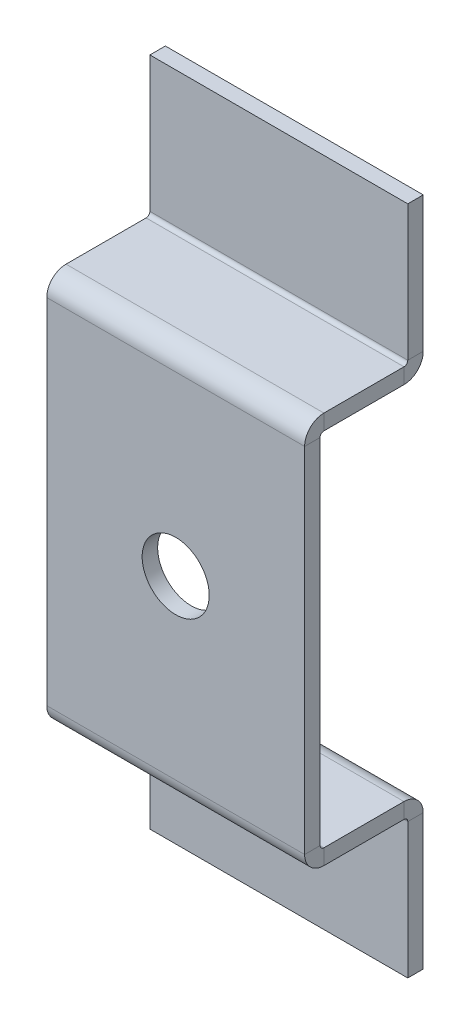
ISO-10303-21;
HEADER;
FILE_DESCRIPTION(('STEP AP214'),'2;1');
FILE_NAME('part.step','',(''),(''),'','','');
FILE_SCHEMA(('AUTOMOTIVE_DESIGN { 1 0 10303 214 1 1 1 1 }'));
ENDSEC;
DATA;
#1=APPLICATION_CONTEXT('core data for automotive mechanical design processes');
#2=APPLICATION_PROTOCOL_DEFINITION('international standard','automotive_design',2000,#1);
#3=PRODUCT_CONTEXT('',#1,'mechanical');
#4=PRODUCT('Part','Part','',(#3));
#5=PRODUCT_RELATED_PRODUCT_CATEGORY('part','',(#4));
#6=PRODUCT_DEFINITION_FORMATION('','',#4);
#7=PRODUCT_DEFINITION_CONTEXT('part definition',#1,'design');
#8=PRODUCT_DEFINITION('design','',#6,#7);
#9=PRODUCT_DEFINITION_SHAPE('','',#8);
#10=(LENGTH_UNIT() NAMED_UNIT(*) SI_UNIT(.MILLI.,.METRE.));
#11=(NAMED_UNIT(*) PLANE_ANGLE_UNIT() SI_UNIT($,.RADIAN.));
#12=(NAMED_UNIT(*) SI_UNIT($,.STERADIAN.) SOLID_ANGLE_UNIT());
#13=UNCERTAINTY_MEASURE_WITH_UNIT(LENGTH_MEASURE(1.E-05),#10,'distance_accuracy_value','');
#14=(GEOMETRIC_REPRESENTATION_CONTEXT(3) GLOBAL_UNCERTAINTY_ASSIGNED_CONTEXT((#13)) GLOBAL_UNIT_ASSIGNED_CONTEXT((#10,
#11,#12)) REPRESENTATION_CONTEXT('',''));
#15=CARTESIAN_POINT('',(0.,0.,0.));
#16=DIRECTION('',(0.,0.,1.));
#17=DIRECTION('',(1.,0.,0.));
#18=AXIS2_PLACEMENT_3D('',#15,#16,#17);
#19=CARTESIAN_POINT('',(0.,73.0000000000001,-20.));
#20=DIRECTION('',(-1.,0.,0.));
#21=DIRECTION('',(0.,0.,1.));
#22=AXIS2_PLACEMENT_3D('',#19,#20,#21);
#23=PLANE('',#22);
#24=DIRECTION('',(0.,0.,-1.));
#25=VECTOR('',#24,1.);
#26=CARTESIAN_POINT('',(0.,73.0000000000001,-20.));
#27=LINE('',#26,#25);
#28=CARTESIAN_POINT('',(0.,73.,-3.7366));
#29=VERTEX_POINT('',#28);
#30=CARTESIAN_POINT('',(0.,73.0000000000001,-19.2634));
#31=VERTEX_POINT('',#30);
#32=EDGE_CURVE('E351',#29,#31,#27,.T.);
#33=ORIENTED_EDGE('',*,*,#32,.T.);
#34=DIRECTION('',(0.,-1.,0.));
#35=VECTOR('',#34,1.);
#36=CARTESIAN_POINT('',(0.,73.0000000000001,-19.2634));
#37=LINE('',#36,#35);
#38=CARTESIAN_POINT('',(0.,70.0000000000001,-19.2634));
#39=VERTEX_POINT('',#38);
#40=EDGE_CURVE('E233',#31,#39,#37,.T.);
#41=ORIENTED_EDGE('',*,*,#40,.T.);
#42=DIRECTION('',(0.,0.,-1.));
#43=VECTOR('',#42,1.);
#44=CARTESIAN_POINT('',(0.,70.0000000000001,-20.));
#45=LINE('',#44,#43);
#46=CARTESIAN_POINT('',(0.,70.,-3.73660000000001));
#47=VERTEX_POINT('',#46);
#48=EDGE_CURVE('E350',#47,#39,#45,.T.);
#49=ORIENTED_EDGE('',*,*,#48,.F.);
#50=DIRECTION('',(0.,1.,0.));
#51=VECTOR('',#50,1.);
#52=CARTESIAN_POINT('',(0.,70.,-3.73660000000001));
#53=LINE('',#52,#51);
#54=EDGE_CURVE('E336',#47,#29,#53,.T.);
#55=ORIENTED_EDGE('',*,*,#54,.T.);
#56=EDGE_LOOP('',(#33,#41,#49,#55));
#57=FACE_BOUND('',#56,.T.);
#58=ADVANCED_FACE('F39',(#57),#23,.T.);
#59=CARTESIAN_POINT('',(0.,73.,2.39049772615826E-13));
#60=DIRECTION('',(0.,1.,0.));
#61=DIRECTION('',(0.,0.,1.));
#62=AXIS2_PLACEMENT_3D('',#59,#60,#61);
#63=PLANE('',#62);
#64=DIRECTION('',(0.,0.,1.));
#65=VECTOR('',#64,1.);
#66=CARTESIAN_POINT('',(50.,73.,-2.99999999999999));
#67=LINE('',#66,#65);
#68=CARTESIAN_POINT('',(50.,73.0000000000001,-19.2634));
#69=VERTEX_POINT('',#68);
#70=CARTESIAN_POINT('',(50.,73.,-3.7366));
#71=VERTEX_POINT('',#70);
#72=EDGE_CURVE('E353',#69,#71,#67,.T.);
#73=ORIENTED_EDGE('',*,*,#72,.F.);
#74=DIRECTION('',(-1.,0.,0.));
#75=VECTOR('',#74,1.);
#76=CARTESIAN_POINT('',(0.,73.0000000000001,-19.2634));
#77=LINE('',#76,#75);
#78=EDGE_CURVE('E63',#31,#69,#77,.F.);
#79=ORIENTED_EDGE('',*,*,#78,.F.);
#80=ORIENTED_EDGE('',*,*,#32,.F.);
#81=DIRECTION('',(1.,0.,0.));
#82=VECTOR('',#81,1.);
#83=CARTESIAN_POINT('',(0.,73.,-3.7366));
#84=LINE('',#83,#82);
#85=EDGE_CURVE('E345',#29,#71,#84,.T.);
#86=ORIENTED_EDGE('',*,*,#85,.T.);
#87=EDGE_LOOP('',(#73,#79,#80,#86));
#88=FACE_BOUND('',#87,.T.);
#89=ADVANCED_FACE('F400',(#88),#63,.T.);
#90=CARTESIAN_POINT('',(0.,70.,2.28575328599297E-13));
#91=DIRECTION('',(0.,1.,0.));
#92=DIRECTION('',(0.,0.,1.));
#93=AXIS2_PLACEMENT_3D('',#90,#91,#92);
#94=PLANE('',#93);
#95=DIRECTION('',(-1.,0.,0.));
#96=VECTOR('',#95,1.);
#97=CARTESIAN_POINT('',(0.,70.0000000000001,-19.2634));
#98=LINE('',#97,#96);
#99=CARTESIAN_POINT('',(50.,70.0000000000001,-19.2634));
#100=VERTEX_POINT('',#99);
#101=EDGE_CURVE('E186',#39,#100,#98,.F.);
#102=ORIENTED_EDGE('',*,*,#101,.T.);
#103=DIRECTION('',(0.,0.,1.));
#104=VECTOR('',#103,1.);
#105=CARTESIAN_POINT('',(50.,70.,-3.));
#106=LINE('',#105,#104);
#107=CARTESIAN_POINT('',(50.,70.,-3.73660000000001));
#108=VERTEX_POINT('',#107);
#109=EDGE_CURVE('E354',#100,#108,#106,.T.);
#110=ORIENTED_EDGE('',*,*,#109,.T.);
#111=DIRECTION('',(1.,0.,0.));
#112=VECTOR('',#111,1.);
#113=CARTESIAN_POINT('',(0.,70.,-3.73660000000001));
#114=LINE('',#113,#112);
#115=EDGE_CURVE('E339',#47,#108,#114,.T.);
#116=ORIENTED_EDGE('',*,*,#115,.F.);
#117=ORIENTED_EDGE('',*,*,#48,.T.);
#118=EDGE_LOOP('',(#102,#110,#116,#117));
#119=FACE_BOUND('',#118,.T.);
#120=ADVANCED_FACE('F408',(#119),#94,.F.);
#121=CARTESIAN_POINT('',(50.,-3.,-2.99999999999999));
#122=DIRECTION('',(1.,0.,0.));
#123=DIRECTION('',(0.,0.,-1.));
#124=AXIS2_PLACEMENT_3D('',#121,#122,#123);
#125=PLANE('',#124);
#126=DIRECTION('',(0.,0.,-1.));
#127=VECTOR('',#126,1.);
#128=CARTESIAN_POINT('',(50.,-3.,-2.99999999999999));
#129=LINE('',#128,#127);
#130=CARTESIAN_POINT('',(50.,-3.,-3.73659999999999));
#131=VERTEX_POINT('',#130);
#132=CARTESIAN_POINT('',(50.,-3.00000000000006,-19.2634));
#133=VERTEX_POINT('',#132);
#134=EDGE_CURVE('E306',#131,#133,#129,.T.);
#135=ORIENTED_EDGE('',*,*,#134,.T.);
#136=DIRECTION('',(0.,1.,0.));
#137=VECTOR('',#136,1.);
#138=CARTESIAN_POINT('',(50.,-3.00000000000006,-19.2634));
#139=LINE('',#138,#137);
#140=CARTESIAN_POINT('',(50.,0.,-19.2634));
#141=VERTEX_POINT('',#140);
#142=EDGE_CURVE('E279',#133,#141,#139,.T.);
#143=ORIENTED_EDGE('',*,*,#142,.T.);
#144=DIRECTION('',(0.,0.,-1.));
#145=VECTOR('',#144,1.);
#146=CARTESIAN_POINT('',(50.,0.,-3.));
#147=LINE('',#146,#145);
#148=CARTESIAN_POINT('',(50.,0.,-3.7366));
#149=VERTEX_POINT('',#148);
#150=EDGE_CURVE('E305',#149,#141,#147,.T.);
#151=ORIENTED_EDGE('',*,*,#150,.F.);
#152=DIRECTION('',(0.,-1.,0.));
#153=VECTOR('',#152,1.);
#154=CARTESIAN_POINT('',(50.,0.,-3.7366));
#155=LINE('',#154,#153);
#156=EDGE_CURVE('E292',#149,#131,#155,.T.);
#157=ORIENTED_EDGE('',*,*,#156,.T.);
#158=EDGE_LOOP('',(#135,#143,#151,#157));
#159=FACE_BOUND('',#158,.T.);
#160=ADVANCED_FACE('F432',(#159),#125,.T.);
#161=CARTESIAN_POINT('',(0.,-2.99999999999999,0.));
#162=DIRECTION('',(0.,1.,0.));
#163=DIRECTION('',(0.,0.,1.));
#164=AXIS2_PLACEMENT_3D('',#161,#162,#163);
#165=PLANE('',#164);
#166=DIRECTION('',(1.,0.,0.));
#167=VECTOR('',#166,1.);
#168=CARTESIAN_POINT('',(50.,-3.00000000000006,-19.2634));
#169=LINE('',#168,#167);
#170=CARTESIAN_POINT('',(0.,-3.00000000000006,-19.2634));
#171=VERTEX_POINT('',#170);
#172=EDGE_CURVE('E285',#133,#171,#169,.F.);
#173=ORIENTED_EDGE('',*,*,#172,.F.);
#174=ORIENTED_EDGE('',*,*,#134,.F.);
#175=DIRECTION('',(1.,0.,0.));
#176=VECTOR('',#175,1.);
#177=CARTESIAN_POINT('',(0.,-3.,-3.73659999999999));
#178=LINE('',#177,#176);
#179=CARTESIAN_POINT('',(0.,-3.,-3.73659999999999));
#180=VERTEX_POINT('',#179);
#181=EDGE_CURVE('E301',#180,#131,#178,.T.);
#182=ORIENTED_EDGE('',*,*,#181,.F.);
#183=DIRECTION('',(0.,0.,1.));
#184=VECTOR('',#183,1.);
#185=CARTESIAN_POINT('',(0.,-3.00000000000006,-20.));
#186=LINE('',#185,#184);
#187=EDGE_CURVE('E309',#171,#180,#186,.T.);
#188=ORIENTED_EDGE('',*,*,#187,.F.);
#189=EDGE_LOOP('',(#173,#174,#182,#188));
#190=FACE_BOUND('',#189,.T.);
#191=ADVANCED_FACE('F445',(#190),#165,.F.);
#192=CARTESIAN_POINT('',(0.,0.,0.));
#193=DIRECTION('',(0.,1.,0.));
#194=DIRECTION('',(0.,0.,1.));
#195=AXIS2_PLACEMENT_3D('',#192,#193,#194);
#196=PLANE('',#195);
#197=ORIENTED_EDGE('',*,*,#150,.T.);
#198=DIRECTION('',(1.,0.,0.));
#199=VECTOR('',#198,1.);
#200=CARTESIAN_POINT('',(50.,0.,-19.2634));
#201=LINE('',#200,#199);
#202=CARTESIAN_POINT('',(0.,0.,-19.2634));
#203=VERTEX_POINT('',#202);
#204=EDGE_CURVE('E272',#141,#203,#201,.F.);
#205=ORIENTED_EDGE('',*,*,#204,.T.);
#206=DIRECTION('',(0.,0.,1.));
#207=VECTOR('',#206,1.);
#208=CARTESIAN_POINT('',(0.,0.,-20.));
#209=LINE('',#208,#207);
#210=CARTESIAN_POINT('',(0.,0.,-3.7366));
#211=VERTEX_POINT('',#210);
#212=EDGE_CURVE('E310',#203,#211,#209,.T.);
#213=ORIENTED_EDGE('',*,*,#212,.T.);
#214=DIRECTION('',(-1.,0.,0.));
#215=VECTOR('',#214,1.);
#216=CARTESIAN_POINT('',(50.,0.,-3.7366));
#217=LINE('',#216,#215);
#218=EDGE_CURVE('E295',#149,#211,#217,.T.);
#219=ORIENTED_EDGE('',*,*,#218,.F.);
#220=EDGE_LOOP('',(#197,#205,#213,#219));
#221=FACE_BOUND('',#220,.T.);
#222=ADVANCED_FACE('F429',(#221),#196,.T.);
#223=CARTESIAN_POINT('',(0.,0.,-3.));
#224=DIRECTION('',(0.,0.,-1.));
#225=DIRECTION('',(-1.,0.,0.));
#226=AXIS2_PLACEMENT_3D('',#223,#224,#225);
#227=PLANE('',#226);
#228=CARTESIAN_POINT('',(25.,34.9999999999999,-3.));
#229=DIRECTION('',(0.,0.,-1.));
#230=DIRECTION('',(-1.,0.,0.));
#231=AXIS2_PLACEMENT_3D('',#228,#229,#230);
#232=CIRCLE('',#231,6.5);
#233=CARTESIAN_POINT('',(18.5,34.9999999999999,-3.));
#234=VERTEX_POINT('',#233);
#235=EDGE_CURVE('E489',#234,#234,#232,.T.);
#236=ORIENTED_EDGE('',*,*,#235,.F.);
#237=EDGE_LOOP('',(#236));
#238=FACE_BOUND('',#237,.T.);
#239=DIRECTION('',(0.,1.,0.));
#240=VECTOR('',#239,1.);
#241=CARTESIAN_POINT('',(50.,0.,-3.));
#242=LINE('',#241,#240);
#243=CARTESIAN_POINT('',(50.,0.736600000000001,-3.));
#244=VERTEX_POINT('',#243);
#245=CARTESIAN_POINT('',(50.,69.2634,-3.));
#246=VERTEX_POINT('',#245);
#247=EDGE_CURVE('E11',#244,#246,#242,.T.);
#248=ORIENTED_EDGE('',*,*,#247,.F.);
#249=DIRECTION('',(-1.,0.,0.));
#250=VECTOR('',#249,1.);
#251=CARTESIAN_POINT('',(0.,0.736599999999997,-3.));
#252=LINE('',#251,#250);
#253=CARTESIAN_POINT('',(0.,0.736599999999997,-3.));
#254=VERTEX_POINT('',#253);
#255=EDGE_CURVE('E328',#254,#244,#252,.F.);
#256=ORIENTED_EDGE('',*,*,#255,.F.);
#257=DIRECTION('',(0.,-1.,0.));
#258=VECTOR('',#257,1.);
#259=CARTESIAN_POINT('',(0.,0.,-3.));
#260=LINE('',#259,#258);
#261=CARTESIAN_POINT('',(0.,69.2634,-3.));
#262=VERTEX_POINT('',#261);
#263=EDGE_CURVE('E48',#262,#254,#260,.T.);
#264=ORIENTED_EDGE('',*,*,#263,.F.);
#265=DIRECTION('',(1.,0.,0.));
#266=VECTOR('',#265,1.);
#267=CARTESIAN_POINT('',(50.,69.2634,-3.));
#268=LINE('',#267,#266);
#269=EDGE_CURVE('E372',#246,#262,#268,.F.);
#270=ORIENTED_EDGE('',*,*,#269,.F.);
#271=EDGE_LOOP('',(#248,#256,#264,#270));
#272=FACE_BOUND('',#271,.T.);
#273=ADVANCED_FACE('F415',(#238,#272),#227,.T.);
#274=CARTESIAN_POINT('',(0.,0.,0.));
#275=DIRECTION('',(0.,0.,-1.));
#276=DIRECTION('',(-1.,0.,0.));
#277=AXIS2_PLACEMENT_3D('',#274,#275,#276);
#278=PLANE('',#277);
#279=CARTESIAN_POINT('',(25.,34.9999999999999,0.));
#280=DIRECTION('',(0.,0.,1.));
#281=DIRECTION('',(1.,0.,0.));
#282=AXIS2_PLACEMENT_3D('',#279,#280,#281);
#283=CIRCLE('',#282,6.5);
#284=CARTESIAN_POINT('',(31.5,34.9999999999999,0.));
#285=VERTEX_POINT('',#284);
#286=EDGE_CURVE('E487',#285,#285,#283,.T.);
#287=ORIENTED_EDGE('',*,*,#286,.F.);
#288=EDGE_LOOP('',(#287));
#289=FACE_BOUND('',#288,.T.);
#290=DIRECTION('',(-1.,0.,0.));
#291=VECTOR('',#290,1.);
#292=CARTESIAN_POINT('',(0.,0.736600000000005,0.));
#293=LINE('',#292,#291);
#294=CARTESIAN_POINT('',(0.,0.736600000000005,0.));
#295=VERTEX_POINT('',#294);
#296=CARTESIAN_POINT('',(50.,0.736600000000001,0.));
#297=VERTEX_POINT('',#296);
#298=EDGE_CURVE('E316',#295,#297,#293,.F.);
#299=ORIENTED_EDGE('',*,*,#298,.T.);
#300=DIRECTION('',(0.,1.,0.));
#301=VECTOR('',#300,1.);
#302=CARTESIAN_POINT('',(50.,0.,0.));
#303=LINE('',#302,#301);
#304=CARTESIAN_POINT('',(50.,69.2634,0.));
#305=VERTEX_POINT('',#304);
#306=EDGE_CURVE('E43',#297,#305,#303,.T.);
#307=ORIENTED_EDGE('',*,*,#306,.T.);
#308=DIRECTION('',(1.,0.,0.));
#309=VECTOR('',#308,1.);
#310=CARTESIAN_POINT('',(50.,69.2634,0.));
#311=LINE('',#310,#309);
#312=CARTESIAN_POINT('',(0.,69.2634,0.));
#313=VERTEX_POINT('',#312);
#314=EDGE_CURVE('E360',#305,#313,#311,.F.);
#315=ORIENTED_EDGE('',*,*,#314,.T.);
#316=DIRECTION('',(0.,-1.,0.));
#317=VECTOR('',#316,1.);
#318=CARTESIAN_POINT('',(0.,0.,0.));
#319=LINE('',#318,#317);
#320=EDGE_CURVE('E380',#313,#295,#319,.T.);
#321=ORIENTED_EDGE('',*,*,#320,.T.);
#322=EDGE_LOOP('',(#299,#307,#315,#321));
#323=FACE_BOUND('',#322,.T.);
#324=ADVANCED_FACE('F388',(#289,#323),#278,.F.);
#325=CARTESIAN_POINT('',(0.,0.,-3.));
#326=DIRECTION('',(-1.,0.,0.));
#327=DIRECTION('',(0.,-1.,0.));
#328=AXIS2_PLACEMENT_3D('',#325,#326,#327);
#329=PLANE('',#328);
#330=ORIENTED_EDGE('',*,*,#263,.T.);
#331=DIRECTION('',(0.,0.,1.));
#332=VECTOR('',#331,1.);
#333=CARTESIAN_POINT('',(0.,0.736599999999997,-3.));
#334=LINE('',#333,#332);
#335=EDGE_CURVE('E322',#254,#295,#334,.T.);
#336=ORIENTED_EDGE('',*,*,#335,.T.);
#337=ORIENTED_EDGE('',*,*,#320,.F.);
#338=DIRECTION('',(0.,0.,1.));
#339=VECTOR('',#338,1.);
#340=CARTESIAN_POINT('',(0.,69.2634,-3.));
#341=LINE('',#340,#339);
#342=EDGE_CURVE('E377',#262,#313,#341,.T.);
#343=ORIENTED_EDGE('',*,*,#342,.F.);
#344=EDGE_LOOP('',(#330,#336,#337,#343));
#345=FACE_BOUND('',#344,.T.);
#346=ADVANCED_FACE('F41',(#345),#329,.T.);
#347=CARTESIAN_POINT('',(50.,0.,-3.));
#348=DIRECTION('',(1.,0.,0.));
#349=DIRECTION('',(0.,1.,0.));
#350=AXIS2_PLACEMENT_3D('',#347,#348,#349);
#351=PLANE('',#350);
#352=DIRECTION('',(0.,0.,1.));
#353=VECTOR('',#352,1.);
#354=CARTESIAN_POINT('',(50.,0.736600000000001,-3.));
#355=LINE('',#354,#353);
#356=EDGE_CURVE('E333',#244,#297,#355,.T.);
#357=ORIENTED_EDGE('',*,*,#356,.F.);
#358=ORIENTED_EDGE('',*,*,#247,.T.);
#359=DIRECTION('',(0.,0.,1.));
#360=VECTOR('',#359,1.);
#361=CARTESIAN_POINT('',(50.,69.2634,-3.));
#362=LINE('',#361,#360);
#363=EDGE_CURVE('E366',#246,#305,#362,.T.);
#364=ORIENTED_EDGE('',*,*,#363,.T.);
#365=ORIENTED_EDGE('',*,*,#306,.F.);
#366=EDGE_LOOP('',(#357,#358,#364,#365));
#367=FACE_BOUND('',#366,.T.);
#368=ADVANCED_FACE('F455',(#367),#351,.T.);
#369=CARTESIAN_POINT('',(0.,69.2634,-3.73660000000001));
#370=DIRECTION('',(-1.,0.,0.));
#371=DIRECTION('',(0.,0.,1.));
#372=AXIS2_PLACEMENT_3D('',#369,#370,#371);
#373=PLANE('',#372);
#374=ORIENTED_EDGE('',*,*,#54,.F.);
#375=CARTESIAN_POINT('',(0.,69.2634,-3.73660000000001));
#376=DIRECTION('',(1.,0.,0.));
#377=DIRECTION('',(0.,0.,-1.));
#378=AXIS2_PLACEMENT_3D('',#375,#376,#377);
#379=CIRCLE('',#378,0.736600000000004);
#380=EDGE_CURVE('E369',#262,#47,#379,.F.);
#381=ORIENTED_EDGE('',*,*,#380,.F.);
#382=ORIENTED_EDGE('',*,*,#342,.T.);
#383=CARTESIAN_POINT('',(0.,69.2634,-3.73660000000001));
#384=DIRECTION('',(1.,0.,0.));
#385=DIRECTION('',(0.,0.,-1.));
#386=AXIS2_PLACEMENT_3D('',#383,#384,#385);
#387=CIRCLE('',#386,3.7366);
#388=EDGE_CURVE('E362',#313,#29,#387,.F.);
#389=ORIENTED_EDGE('',*,*,#388,.T.);
#390=EDGE_LOOP('',(#374,#381,#382,#389));
#391=FACE_BOUND('',#390,.T.);
#392=ADVANCED_FACE('F402',(#391),#373,.T.);
#393=CARTESIAN_POINT('',(50.,69.2634,-3.73660000000001));
#394=DIRECTION('',(-1.,0.,0.));
#395=DIRECTION('',(0.,0.,1.));
#396=AXIS2_PLACEMENT_3D('',#393,#394,#395);
#397=PLANE('',#396);
#398=CARTESIAN_POINT('',(50.,69.2634,-3.73660000000001));
#399=DIRECTION('',(1.,0.,0.));
#400=DIRECTION('',(0.,0.,-1.));
#401=AXIS2_PLACEMENT_3D('',#398,#399,#400);
#402=CIRCLE('',#401,0.736600000000004);
#403=EDGE_CURVE('E356',#108,#246,#402,.T.);
#404=ORIENTED_EDGE('',*,*,#403,.F.);
#405=DIRECTION('',(0.,1.,0.));
#406=VECTOR('',#405,1.);
#407=CARTESIAN_POINT('',(50.,70.,-3.73660000000001));
#408=LINE('',#407,#406);
#409=EDGE_CURVE('E342',#108,#71,#408,.T.);
#410=ORIENTED_EDGE('',*,*,#409,.T.);
#411=CARTESIAN_POINT('',(50.,69.2634,-3.73660000000001));
#412=DIRECTION('',(1.,0.,0.));
#413=DIRECTION('',(0.,0.,-1.));
#414=AXIS2_PLACEMENT_3D('',#411,#412,#413);
#415=CIRCLE('',#414,3.7366);
#416=EDGE_CURVE('E363',#71,#305,#415,.T.);
#417=ORIENTED_EDGE('',*,*,#416,.T.);
#418=ORIENTED_EDGE('',*,*,#363,.F.);
#419=EDGE_LOOP('',(#404,#410,#417,#418));
#420=FACE_BOUND('',#419,.T.);
#421=ADVANCED_FACE('F398',(#420),#397,.F.);
#422=CARTESIAN_POINT('',(50.,69.2634,-3.73660000000001));
#423=DIRECTION('',(1.,0.,0.));
#424=DIRECTION('',(0.,1.,0.));
#425=AXIS2_PLACEMENT_3D('',#422,#423,#424);
#426=CYLINDRICAL_SURFACE('',#425,3.7366);
#427=ORIENTED_EDGE('',*,*,#314,.F.);
#428=ORIENTED_EDGE('',*,*,#416,.F.);
#429=ORIENTED_EDGE('',*,*,#85,.F.);
#430=ORIENTED_EDGE('',*,*,#388,.F.);
#431=EDGE_LOOP('',(#427,#428,#429,#430));
#432=FACE_BOUND('',#431,.T.);
#433=ADVANCED_FACE('F394',(#432),#426,.T.);
#434=CARTESIAN_POINT('',(50.,69.2634,-3.73660000000001));
#435=DIRECTION('',(1.,0.,0.));
#436=DIRECTION('',(0.,1.,0.));
#437=AXIS2_PLACEMENT_3D('',#434,#435,#436);
#438=CYLINDRICAL_SURFACE('',#437,0.736600000000004);
#439=ORIENTED_EDGE('',*,*,#269,.T.);
#440=ORIENTED_EDGE('',*,*,#380,.T.);
#441=ORIENTED_EDGE('',*,*,#115,.T.);
#442=ORIENTED_EDGE('',*,*,#403,.T.);
#443=EDGE_LOOP('',(#439,#440,#441,#442));
#444=FACE_BOUND('',#443,.T.);
#445=ADVANCED_FACE('F410',(#444),#438,.F.);
#446=CARTESIAN_POINT('',(50.,73.,-2.99999999999999));
#447=DIRECTION('',(1.,0.,0.));
#448=DIRECTION('',(0.,0.,-1.));
#449=AXIS2_PLACEMENT_3D('',#446,#447,#448);
#450=PLANE('',#449);
#451=DIRECTION('',(0.,-1.,0.));
#452=VECTOR('',#451,1.);
#453=CARTESIAN_POINT('',(50.,73.0000000000001,-19.2634));
#454=LINE('',#453,#452);
#455=EDGE_CURVE('E56',#69,#100,#454,.T.);
#456=ORIENTED_EDGE('',*,*,#455,.F.);
#457=ORIENTED_EDGE('',*,*,#72,.T.);
#458=ORIENTED_EDGE('',*,*,#409,.F.);
#459=ORIENTED_EDGE('',*,*,#109,.F.);
#460=EDGE_LOOP('',(#456,#457,#458,#459));
#461=FACE_BOUND('',#460,.T.);
#462=ADVANCED_FACE('F471',(#461),#450,.T.);
#463=CARTESIAN_POINT('',(50.,0.736599999999999,-3.7366));
#464=DIRECTION('',(1.,0.,0.));
#465=DIRECTION('',(0.,1.,0.));
#466=AXIS2_PLACEMENT_3D('',#463,#464,#465);
#467=PLANE('',#466);
#468=ORIENTED_EDGE('',*,*,#156,.F.);
#469=CARTESIAN_POINT('',(50.,0.736599999999999,-3.7366));
#470=DIRECTION('',(-1.,0.,0.));
#471=DIRECTION('',(0.,-1.,0.));
#472=AXIS2_PLACEMENT_3D('',#469,#470,#471);
#473=CIRCLE('',#472,0.736600000000002);
#474=EDGE_CURVE('E325',#244,#149,#473,.F.);
#475=ORIENTED_EDGE('',*,*,#474,.F.);
#476=ORIENTED_EDGE('',*,*,#356,.T.);
#477=CARTESIAN_POINT('',(50.,0.736599999999999,-3.7366));
#478=DIRECTION('',(-1.,0.,0.));
#479=DIRECTION('',(0.,-1.,0.));
#480=AXIS2_PLACEMENT_3D('',#477,#478,#479);
#481=CIRCLE('',#480,3.7366);
#482=EDGE_CURVE('E318',#297,#131,#481,.F.);
#483=ORIENTED_EDGE('',*,*,#482,.T.);
#484=EDGE_LOOP('',(#468,#475,#476,#483));
#485=FACE_BOUND('',#484,.T.);
#486=ADVANCED_FACE('F454',(#485),#467,.T.);
#487=CARTESIAN_POINT('',(0.,0.736599999999996,-3.7366));
#488=DIRECTION('',(1.,0.,0.));
#489=DIRECTION('',(0.,1.,0.));
#490=AXIS2_PLACEMENT_3D('',#487,#488,#489);
#491=PLANE('',#490);
#492=CARTESIAN_POINT('',(0.,0.736599999999996,-3.7366));
#493=DIRECTION('',(-1.,0.,0.));
#494=DIRECTION('',(0.,-1.,0.));
#495=AXIS2_PLACEMENT_3D('',#492,#493,#494);
#496=CIRCLE('',#495,0.736600000000002);
#497=EDGE_CURVE('E312',#211,#254,#496,.T.);
#498=ORIENTED_EDGE('',*,*,#497,.F.);
#499=DIRECTION('',(0.,-1.,0.));
#500=VECTOR('',#499,1.);
#501=CARTESIAN_POINT('',(0.,0.,-3.7366));
#502=LINE('',#501,#500);
#503=EDGE_CURVE('E298',#211,#180,#502,.T.);
#504=ORIENTED_EDGE('',*,*,#503,.T.);
#505=CARTESIAN_POINT('',(0.,0.736599999999996,-3.7366));
#506=DIRECTION('',(-1.,0.,0.));
#507=DIRECTION('',(0.,-1.,0.));
#508=AXIS2_PLACEMENT_3D('',#505,#506,#507);
#509=CIRCLE('',#508,3.7366);
#510=EDGE_CURVE('E319',#180,#295,#509,.T.);
#511=ORIENTED_EDGE('',*,*,#510,.T.);
#512=ORIENTED_EDGE('',*,*,#335,.F.);
#513=EDGE_LOOP('',(#498,#504,#511,#512));
#514=FACE_BOUND('',#513,.T.);
#515=ADVANCED_FACE('F420',(#514),#491,.F.);
#516=CARTESIAN_POINT('',(0.,0.736599999999996,-3.7366));
#517=DIRECTION('',(-1.,0.,0.));
#518=DIRECTION('',(0.,-1.,0.));
#519=AXIS2_PLACEMENT_3D('',#516,#517,#518);
#520=CYLINDRICAL_SURFACE('',#519,3.7366);
#521=ORIENTED_EDGE('',*,*,#298,.F.);
#522=ORIENTED_EDGE('',*,*,#510,.F.);
#523=ORIENTED_EDGE('',*,*,#181,.T.);
#524=ORIENTED_EDGE('',*,*,#482,.F.);
#525=EDGE_LOOP('',(#521,#522,#523,#524));
#526=FACE_BOUND('',#525,.T.);
#527=ADVANCED_FACE('F451',(#526),#520,.T.);
#528=CARTESIAN_POINT('',(0.,0.736599999999996,-3.7366));
#529=DIRECTION('',(-1.,0.,0.));
#530=DIRECTION('',(0.,-1.,0.));
#531=AXIS2_PLACEMENT_3D('',#528,#529,#530);
#532=CYLINDRICAL_SURFACE('',#531,0.736600000000002);
#533=ORIENTED_EDGE('',*,*,#255,.T.);
#534=ORIENTED_EDGE('',*,*,#474,.T.);
#535=ORIENTED_EDGE('',*,*,#218,.T.);
#536=ORIENTED_EDGE('',*,*,#497,.T.);
#537=EDGE_LOOP('',(#533,#534,#535,#536));
#538=FACE_BOUND('',#537,.T.);
#539=ADVANCED_FACE('F424',(#538),#532,.F.);
#540=CARTESIAN_POINT('',(0.,-3.00000000000006,-20.));
#541=DIRECTION('',(-1.,0.,0.));
#542=DIRECTION('',(0.,0.,1.));
#543=AXIS2_PLACEMENT_3D('',#540,#541,#542);
#544=PLANE('',#543);
#545=DIRECTION('',(0.,1.,0.));
#546=VECTOR('',#545,1.);
#547=CARTESIAN_POINT('',(0.,-3.00000000000006,-19.2634));
#548=LINE('',#547,#546);
#549=EDGE_CURVE('E289',#171,#203,#548,.T.);
#550=ORIENTED_EDGE('',*,*,#549,.F.);
#551=ORIENTED_EDGE('',*,*,#187,.T.);
#552=ORIENTED_EDGE('',*,*,#503,.F.);
#553=ORIENTED_EDGE('',*,*,#212,.F.);
#554=EDGE_LOOP('',(#550,#551,#552,#553));
#555=FACE_BOUND('',#554,.T.);
#556=ADVANCED_FACE('F449',(#555),#544,.T.);
#557=CARTESIAN_POINT('',(0.,-3.73660000000006,-19.2634));
#558=DIRECTION('',(-1.,0.,0.));
#559=DIRECTION('',(0.,0.,1.));
#560=AXIS2_PLACEMENT_3D('',#557,#558,#559);
#561=PLANE('',#560);
#562=DIRECTION('',(0.,0.,-1.));
#563=VECTOR('',#562,1.);
#564=CARTESIAN_POINT('',(0.,-3.73660000000006,-20.));
#565=LINE('',#564,#563);
#566=CARTESIAN_POINT('',(0.,-3.73660000000006,-20.));
#567=VERTEX_POINT('',#566);
#568=CARTESIAN_POINT('',(0.,-3.73660000000006,-23.));
#569=VERTEX_POINT('',#568);
#570=EDGE_CURVE('E240',#567,#569,#565,.T.);
#571=ORIENTED_EDGE('',*,*,#570,.F.);
#572=CARTESIAN_POINT('',(0.,-3.73660000000006,-19.2634));
#573=DIRECTION('',(1.,0.,0.));
#574=DIRECTION('',(0.,0.,-1.));
#575=AXIS2_PLACEMENT_3D('',#572,#573,#574);
#576=CIRCLE('',#575,0.7366);
#577=EDGE_CURVE('E282',#171,#567,#576,.F.);
#578=ORIENTED_EDGE('',*,*,#577,.F.);
#579=ORIENTED_EDGE('',*,*,#549,.T.);
#580=CARTESIAN_POINT('',(0.,-3.73660000000006,-19.2634));
#581=DIRECTION('',(1.,0.,0.));
#582=DIRECTION('',(0.,0.,-1.));
#583=AXIS2_PLACEMENT_3D('',#580,#581,#582);
#584=CIRCLE('',#583,3.7366);
#585=EDGE_CURVE('E275',#203,#569,#584,.F.);
#586=ORIENTED_EDGE('',*,*,#585,.T.);
#587=EDGE_LOOP('',(#571,#578,#579,#586));
#588=FACE_BOUND('',#587,.T.);
#589=ADVANCED_FACE('F559',(#588),#561,.T.);
#590=CARTESIAN_POINT('',(50.,-3.73660000000006,-19.2634));
#591=DIRECTION('',(-1.,0.,0.));
#592=DIRECTION('',(0.,0.,1.));
#593=AXIS2_PLACEMENT_3D('',#590,#591,#592);
#594=PLANE('',#593);
#595=CARTESIAN_POINT('',(50.,-3.73660000000006,-19.2634));
#596=DIRECTION('',(1.,0.,0.));
#597=DIRECTION('',(0.,0.,-1.));
#598=AXIS2_PLACEMENT_3D('',#595,#596,#597);
#599=CIRCLE('',#598,0.7366);
#600=CARTESIAN_POINT('',(50.,-3.73660000000006,-20.));
#601=VERTEX_POINT('',#600);
#602=EDGE_CURVE('E271',#601,#133,#599,.T.);
#603=ORIENTED_EDGE('',*,*,#602,.F.);
#604=DIRECTION('',(0.,0.,-1.));
#605=VECTOR('',#604,1.);
#606=CARTESIAN_POINT('',(50.,-3.73660000000006,-20.));
#607=LINE('',#606,#605);
#608=CARTESIAN_POINT('',(50.,-3.73660000000003,-23.));
#609=VERTEX_POINT('',#608);
#610=EDGE_CURVE('E244',#601,#609,#607,.T.);
#611=ORIENTED_EDGE('',*,*,#610,.T.);
#612=CARTESIAN_POINT('',(50.,-3.73660000000006,-19.2634));
#613=DIRECTION('',(1.,0.,0.));
#614=DIRECTION('',(0.,0.,-1.));
#615=AXIS2_PLACEMENT_3D('',#612,#613,#614);
#616=CIRCLE('',#615,3.7366);
#617=EDGE_CURVE('E276',#609,#141,#616,.T.);
#618=ORIENTED_EDGE('',*,*,#617,.T.);
#619=ORIENTED_EDGE('',*,*,#142,.F.);
#620=EDGE_LOOP('',(#603,#611,#618,#619));
#621=FACE_BOUND('',#620,.T.);
#622=ADVANCED_FACE('F436',(#621),#594,.F.);
#623=CARTESIAN_POINT('',(50.,-3.73660000000006,-19.2634));
#624=DIRECTION('',(1.,0.,0.));
#625=DIRECTION('',(0.,0.,-1.));
#626=AXIS2_PLACEMENT_3D('',#623,#624,#625);
#627=CYLINDRICAL_SURFACE('',#626,3.7366);
#628=ORIENTED_EDGE('',*,*,#204,.F.);
#629=ORIENTED_EDGE('',*,*,#617,.F.);
#630=DIRECTION('',(-1.,0.,0.));
#631=VECTOR('',#630,1.);
#632=CARTESIAN_POINT('',(0.,-3.73660000000003,-23.));
#633=LINE('',#632,#631);
#634=EDGE_CURVE('E247',#609,#569,#633,.T.);
#635=ORIENTED_EDGE('',*,*,#634,.T.);
#636=ORIENTED_EDGE('',*,*,#585,.F.);
#637=EDGE_LOOP('',(#628,#629,#635,#636));
#638=FACE_BOUND('',#637,.T.);
#639=ADVANCED_FACE('F553',(#638),#627,.T.);
#640=CARTESIAN_POINT('',(50.,-3.73660000000006,-19.2634));
#641=DIRECTION('',(1.,0.,0.));
#642=DIRECTION('',(0.,0.,-1.));
#643=AXIS2_PLACEMENT_3D('',#640,#641,#642);
#644=CYLINDRICAL_SURFACE('',#643,0.7366);
#645=ORIENTED_EDGE('',*,*,#172,.T.);
#646=ORIENTED_EDGE('',*,*,#577,.T.);
#647=DIRECTION('',(1.,0.,0.));
#648=VECTOR('',#647,1.);
#649=CARTESIAN_POINT('',(0.,-3.73660000000006,-20.));
#650=LINE('',#649,#648);
#651=EDGE_CURVE('E242',#567,#601,#650,.T.);
#652=ORIENTED_EDGE('',*,*,#651,.T.);
#653=ORIENTED_EDGE('',*,*,#602,.T.);
#654=EDGE_LOOP('',(#645,#646,#652,#653));
#655=FACE_BOUND('',#654,.T.);
#656=ADVANCED_FACE('F440',(#655),#644,.F.);
#657=CARTESIAN_POINT('',(50.,-30.0000000000001,-23.));
#658=DIRECTION('',(-1.,0.,0.));
#659=DIRECTION('',(0.,0.,1.));
#660=AXIS2_PLACEMENT_3D('',#657,#658,#659);
#661=PLANE('',#660);
#662=ORIENTED_EDGE('',*,*,#610,.F.);
#663=DIRECTION('',(0.,-1.,0.));
#664=VECTOR('',#663,1.);
#665=CARTESIAN_POINT('',(50.,-30.0000000000001,-20.));
#666=LINE('',#665,#664);
#667=CARTESIAN_POINT('',(50.,-30.0000000000001,-20.));
#668=VERTEX_POINT('',#667);
#669=EDGE_CURVE('E251',#601,#668,#666,.T.);
#670=ORIENTED_EDGE('',*,*,#669,.T.);
#671=DIRECTION('',(0.,0.,1.));
#672=VECTOR('',#671,1.);
#673=CARTESIAN_POINT('',(50.,-30.0000000000001,-23.));
#674=LINE('',#673,#672);
#675=CARTESIAN_POINT('',(50.,-30.0000000000001,-23.));
#676=VERTEX_POINT('',#675);
#677=EDGE_CURVE('E268',#676,#668,#674,.T.);
#678=ORIENTED_EDGE('',*,*,#677,.F.);
#679=DIRECTION('',(0.,-1.,0.));
#680=VECTOR('',#679,1.);
#681=CARTESIAN_POINT('',(50.,-30.0000000000001,-23.));
#682=LINE('',#681,#680);
#683=EDGE_CURVE('E252',#609,#676,#682,.T.);
#684=ORIENTED_EDGE('',*,*,#683,.F.);
#685=EDGE_LOOP('',(#662,#670,#678,#684));
#686=FACE_BOUND('',#685,.T.);
#687=ADVANCED_FACE('F545',(#686),#661,.F.);
#688=CARTESIAN_POINT('',(0.,-3.00000000000006,-23.));
#689=DIRECTION('',(1.,0.,0.));
#690=DIRECTION('',(0.,0.,-1.));
#691=AXIS2_PLACEMENT_3D('',#688,#689,#690);
#692=PLANE('',#691);
#693=ORIENTED_EDGE('',*,*,#570,.T.);
#694=DIRECTION('',(0.,1.,0.));
#695=VECTOR('',#694,1.);
#696=CARTESIAN_POINT('',(0.,-3.00000000000006,-23.));
#697=LINE('',#696,#695);
#698=CARTESIAN_POINT('',(0.,-30.0000000000001,-23.));
#699=VERTEX_POINT('',#698);
#700=EDGE_CURVE('E257',#699,#569,#697,.T.);
#701=ORIENTED_EDGE('',*,*,#700,.F.);
#702=DIRECTION('',(0.,0.,1.));
#703=VECTOR('',#702,1.);
#704=CARTESIAN_POINT('',(0.,-30.0000000000001,-23.));
#705=LINE('',#704,#703);
#706=CARTESIAN_POINT('',(0.,-30.0000000000001,-20.));
#707=VERTEX_POINT('',#706);
#708=EDGE_CURVE('E260',#699,#707,#705,.T.);
#709=ORIENTED_EDGE('',*,*,#708,.T.);
#710=DIRECTION('',(0.,1.,0.));
#711=VECTOR('',#710,1.);
#712=CARTESIAN_POINT('',(0.,-3.00000000000006,-20.));
#713=LINE('',#712,#711);
#714=EDGE_CURVE('E255',#707,#567,#713,.T.);
#715=ORIENTED_EDGE('',*,*,#714,.T.);
#716=EDGE_LOOP('',(#693,#701,#709,#715));
#717=FACE_BOUND('',#716,.T.);
#718=ADVANCED_FACE('F538',(#717),#692,.F.);
#719=CARTESIAN_POINT('',(0.,0.,-23.));
#720=DIRECTION('',(0.,0.,1.));
#721=DIRECTION('',(1.,0.,0.));
#722=AXIS2_PLACEMENT_3D('',#719,#720,#721);
#723=PLANE('',#722);
#724=ORIENTED_EDGE('',*,*,#634,.F.);
#725=ORIENTED_EDGE('',*,*,#683,.T.);
#726=DIRECTION('',(-1.,0.,0.));
#727=VECTOR('',#726,1.);
#728=CARTESIAN_POINT('',(0.,-30.0000000000001,-23.));
#729=LINE('',#728,#727);
#730=EDGE_CURVE('E254',#676,#699,#729,.T.);
#731=ORIENTED_EDGE('',*,*,#730,.T.);
#732=ORIENTED_EDGE('',*,*,#700,.T.);
#733=EDGE_LOOP('',(#724,#725,#731,#732));
#734=FACE_BOUND('',#733,.T.);
#735=ADVANCED_FACE('F534',(#734),#723,.F.);
#736=CARTESIAN_POINT('',(0.,0.,-20.));
#737=DIRECTION('',(0.,0.,1.));
#738=DIRECTION('',(1.,0.,0.));
#739=AXIS2_PLACEMENT_3D('',#736,#737,#738);
#740=PLANE('',#739);
#741=ORIENTED_EDGE('',*,*,#669,.F.);
#742=ORIENTED_EDGE('',*,*,#651,.F.);
#743=ORIENTED_EDGE('',*,*,#714,.F.);
#744=DIRECTION('',(-1.,0.,0.));
#745=VECTOR('',#744,1.);
#746=CARTESIAN_POINT('',(0.,-30.0000000000001,-20.));
#747=LINE('',#746,#745);
#748=EDGE_CURVE('E262',#668,#707,#747,.T.);
#749=ORIENTED_EDGE('',*,*,#748,.F.);
#750=EDGE_LOOP('',(#741,#742,#743,#749));
#751=FACE_BOUND('',#750,.T.);
#752=ADVANCED_FACE('F537',(#751),#740,.T.);
#753=CARTESIAN_POINT('',(0.,-30.0000000000001,-23.));
#754=DIRECTION('',(0.,1.,0.));
#755=DIRECTION('',(0.,0.,1.));
#756=AXIS2_PLACEMENT_3D('',#753,#754,#755);
#757=PLANE('',#756);
#758=ORIENTED_EDGE('',*,*,#748,.T.);
#759=ORIENTED_EDGE('',*,*,#708,.F.);
#760=ORIENTED_EDGE('',*,*,#730,.F.);
#761=ORIENTED_EDGE('',*,*,#677,.T.);
#762=EDGE_LOOP('',(#758,#759,#760,#761));
#763=FACE_BOUND('',#762,.T.);
#764=ADVANCED_FACE('F531',(#763),#757,.F.);
#765=CARTESIAN_POINT('',(50.,73.7366000000001,-19.2634));
#766=DIRECTION('',(1.,0.,0.));
#767=DIRECTION('',(0.,0.,-1.));
#768=AXIS2_PLACEMENT_3D('',#765,#766,#767);
#769=PLANE('',#768);
#770=DIRECTION('',(0.,0.,-1.));
#771=VECTOR('',#770,1.);
#772=CARTESIAN_POINT('',(50.,73.7366000000001,-20.));
#773=LINE('',#772,#771);
#774=CARTESIAN_POINT('',(50.,73.7366000000001,-20.));
#775=VERTEX_POINT('',#774);
#776=CARTESIAN_POINT('',(50.,73.7366000000001,-23.));
#777=VERTEX_POINT('',#776);
#778=EDGE_CURVE('E492',#775,#777,#773,.T.);
#779=ORIENTED_EDGE('',*,*,#778,.F.);
#780=CARTESIAN_POINT('',(50.,73.7366000000001,-19.2634));
#781=DIRECTION('',(-1.,0.,0.));
#782=DIRECTION('',(0.,0.,1.));
#783=AXIS2_PLACEMENT_3D('',#780,#781,#782);
#784=CIRCLE('',#783,0.7366);
#785=EDGE_CURVE('E189',#69,#775,#784,.F.);
#786=ORIENTED_EDGE('',*,*,#785,.F.);
#787=ORIENTED_EDGE('',*,*,#455,.T.);
#788=CARTESIAN_POINT('',(50.,73.7366000000001,-19.2634));
#789=DIRECTION('',(-1.,0.,0.));
#790=DIRECTION('',(0.,0.,1.));
#791=AXIS2_PLACEMENT_3D('',#788,#789,#790);
#792=CIRCLE('',#791,3.7366);
#793=EDGE_CURVE('E232',#100,#777,#792,.F.);
#794=ORIENTED_EDGE('',*,*,#793,.T.);
#795=EDGE_LOOP('',(#779,#786,#787,#794));
#796=FACE_BOUND('',#795,.T.);
#797=ADVANCED_FACE('F501',(#796),#769,.T.);
#798=CARTESIAN_POINT('',(0.,73.7366000000001,-19.2634));
#799=DIRECTION('',(1.,0.,0.));
#800=DIRECTION('',(0.,0.,-1.));
#801=AXIS2_PLACEMENT_3D('',#798,#799,#800);
#802=PLANE('',#801);
#803=CARTESIAN_POINT('',(0.,73.7366000000001,-19.2634));
#804=DIRECTION('',(-1.,0.,0.));
#805=DIRECTION('',(0.,0.,1.));
#806=AXIS2_PLACEMENT_3D('',#803,#804,#805);
#807=CIRCLE('',#806,0.7366);
#808=CARTESIAN_POINT('',(0.,73.7366000000001,-20.));
#809=VERTEX_POINT('',#808);
#810=EDGE_CURVE('E196',#809,#31,#807,.T.);
#811=ORIENTED_EDGE('',*,*,#810,.F.);
#812=DIRECTION('',(0.,0.,-1.));
#813=VECTOR('',#812,1.);
#814=CARTESIAN_POINT('',(0.,73.7366000000001,-20.));
#815=LINE('',#814,#813);
#816=CARTESIAN_POINT('',(0.,73.7366000000001,-23.));
#817=VERTEX_POINT('',#816);
#818=EDGE_CURVE('E193',#809,#817,#815,.T.);
#819=ORIENTED_EDGE('',*,*,#818,.T.);
#820=CARTESIAN_POINT('',(0.,73.7366000000001,-19.2634));
#821=DIRECTION('',(-1.,0.,0.));
#822=DIRECTION('',(0.,0.,1.));
#823=AXIS2_PLACEMENT_3D('',#820,#821,#822);
#824=CIRCLE('',#823,3.7366);
#825=EDGE_CURVE('E179',#817,#39,#824,.T.);
#826=ORIENTED_EDGE('',*,*,#825,.T.);
#827=ORIENTED_EDGE('',*,*,#40,.F.);
#828=EDGE_LOOP('',(#811,#819,#826,#827));
#829=FACE_BOUND('',#828,.T.);
#830=ADVANCED_FACE('F194',(#829),#802,.F.);
#831=CARTESIAN_POINT('',(0.,73.7366000000001,-19.2634));
#832=DIRECTION('',(-1.,0.,0.));
#833=DIRECTION('',(0.,0.,-1.));
#834=AXIS2_PLACEMENT_3D('',#831,#832,#833);
#835=CYLINDRICAL_SURFACE('',#834,3.7366);
#836=ORIENTED_EDGE('',*,*,#101,.F.);
#837=ORIENTED_EDGE('',*,*,#825,.F.);
#838=DIRECTION('',(1.,0.,0.));
#839=VECTOR('',#838,1.);
#840=CARTESIAN_POINT('',(0.,73.7366000000001,-23.));
#841=LINE('',#840,#839);
#842=EDGE_CURVE('E184',#817,#777,#841,.T.);
#843=ORIENTED_EDGE('',*,*,#842,.T.);
#844=ORIENTED_EDGE('',*,*,#793,.F.);
#845=EDGE_LOOP('',(#836,#837,#843,#844));
#846=FACE_BOUND('',#845,.T.);
#847=ADVANCED_FACE('F181',(#846),#835,.T.);
#848=CARTESIAN_POINT('',(0.,73.7366000000001,-19.2634));
#849=DIRECTION('',(-1.,0.,0.));
#850=DIRECTION('',(0.,0.,-1.));
#851=AXIS2_PLACEMENT_3D('',#848,#849,#850);
#852=CYLINDRICAL_SURFACE('',#851,0.7366);
#853=ORIENTED_EDGE('',*,*,#78,.T.);
#854=ORIENTED_EDGE('',*,*,#785,.T.);
#855=DIRECTION('',(-1.,0.,0.));
#856=VECTOR('',#855,1.);
#857=CARTESIAN_POINT('',(50.,73.7366000000001,-20.));
#858=LINE('',#857,#856);
#859=EDGE_CURVE('E200',#775,#809,#858,.T.);
#860=ORIENTED_EDGE('',*,*,#859,.T.);
#861=ORIENTED_EDGE('',*,*,#810,.T.);
#862=EDGE_LOOP('',(#853,#854,#860,#861));
#863=FACE_BOUND('',#862,.T.);
#864=ADVANCED_FACE('F504',(#863),#852,.F.);
#865=CARTESIAN_POINT('',(0.,100.,-23.));
#866=DIRECTION('',(1.,0.,0.));
#867=DIRECTION('',(0.,0.,-1.));
#868=AXIS2_PLACEMENT_3D('',#865,#866,#867);
#869=PLANE('',#868);
#870=ORIENTED_EDGE('',*,*,#818,.F.);
#871=DIRECTION('',(0.,1.,0.));
#872=VECTOR('',#871,1.);
#873=CARTESIAN_POINT('',(0.,100.,-20.));
#874=LINE('',#873,#872);
#875=CARTESIAN_POINT('',(0.,100.,-20.));
#876=VERTEX_POINT('',#875);
#877=EDGE_CURVE('E209',#809,#876,#874,.T.);
#878=ORIENTED_EDGE('',*,*,#877,.T.);
#879=DIRECTION('',(0.,0.,1.));
#880=VECTOR('',#879,1.);
#881=CARTESIAN_POINT('',(0.,100.,-23.));
#882=LINE('',#881,#880);
#883=CARTESIAN_POINT('',(0.,100.,-23.));
#884=VERTEX_POINT('',#883);
#885=EDGE_CURVE('E214',#884,#876,#882,.T.);
#886=ORIENTED_EDGE('',*,*,#885,.F.);
#887=DIRECTION('',(0.,1.,0.));
#888=VECTOR('',#887,1.);
#889=CARTESIAN_POINT('',(0.,100.,-23.));
#890=LINE('',#889,#888);
#891=EDGE_CURVE('E205',#817,#884,#890,.T.);
#892=ORIENTED_EDGE('',*,*,#891,.F.);
#893=EDGE_LOOP('',(#870,#878,#886,#892));
#894=FACE_BOUND('',#893,.T.);
#895=ADVANCED_FACE('F212',(#894),#869,.F.);
#896=CARTESIAN_POINT('',(50.,73.0000000000001,-23.));
#897=DIRECTION('',(-1.,0.,0.));
#898=DIRECTION('',(0.,0.,1.));
#899=AXIS2_PLACEMENT_3D('',#896,#897,#898);
#900=PLANE('',#899);
#901=ORIENTED_EDGE('',*,*,#778,.T.);
#902=DIRECTION('',(0.,-1.,0.));
#903=VECTOR('',#902,1.);
#904=CARTESIAN_POINT('',(50.,73.0000000000001,-23.));
#905=LINE('',#904,#903);
#906=CARTESIAN_POINT('',(50.,100.,-23.));
#907=VERTEX_POINT('',#906);
#908=EDGE_CURVE('E208',#907,#777,#905,.T.);
#909=ORIENTED_EDGE('',*,*,#908,.F.);
#910=DIRECTION('',(0.,0.,1.));
#911=VECTOR('',#910,1.);
#912=CARTESIAN_POINT('',(50.,100.,-23.));
#913=LINE('',#912,#911);
#914=CARTESIAN_POINT('',(50.,100.,-20.));
#915=VERTEX_POINT('',#914);
#916=EDGE_CURVE('E225',#907,#915,#913,.T.);
#917=ORIENTED_EDGE('',*,*,#916,.T.);
#918=DIRECTION('',(0.,-1.,0.));
#919=VECTOR('',#918,1.);
#920=CARTESIAN_POINT('',(50.,73.0000000000001,-20.));
#921=LINE('',#920,#919);
#922=EDGE_CURVE('E216',#915,#775,#921,.T.);
#923=ORIENTED_EDGE('',*,*,#922,.T.);
#924=EDGE_LOOP('',(#901,#909,#917,#923));
#925=FACE_BOUND('',#924,.T.);
#926=ADVANCED_FACE('F497',(#925),#900,.F.);
#927=CARTESIAN_POINT('',(0.,0.,-23.));
#928=DIRECTION('',(0.,0.,1.));
#929=DIRECTION('',(0.,-1.,0.));
#930=AXIS2_PLACEMENT_3D('',#927,#928,#929);
#931=PLANE('',#930);
#932=ORIENTED_EDGE('',*,*,#842,.F.);
#933=ORIENTED_EDGE('',*,*,#891,.T.);
#934=DIRECTION('',(1.,0.,0.));
#935=VECTOR('',#934,1.);
#936=CARTESIAN_POINT('',(50.,100.,-23.));
#937=LINE('',#936,#935);
#938=EDGE_CURVE('E215',#884,#907,#937,.T.);
#939=ORIENTED_EDGE('',*,*,#938,.T.);
#940=ORIENTED_EDGE('',*,*,#908,.T.);
#941=EDGE_LOOP('',(#932,#933,#939,#940));
#942=FACE_BOUND('',#941,.T.);
#943=ADVANCED_FACE('F204',(#942),#931,.F.);
#944=CARTESIAN_POINT('',(0.,0.,-20.));
#945=DIRECTION('',(0.,0.,1.));
#946=DIRECTION('',(0.,-1.,0.));
#947=AXIS2_PLACEMENT_3D('',#944,#945,#946);
#948=PLANE('',#947);
#949=ORIENTED_EDGE('',*,*,#877,.F.);
#950=ORIENTED_EDGE('',*,*,#859,.F.);
#951=ORIENTED_EDGE('',*,*,#922,.F.);
#952=DIRECTION('',(1.,0.,0.));
#953=VECTOR('',#952,1.);
#954=CARTESIAN_POINT('',(50.,100.,-20.));
#955=LINE('',#954,#953);
#956=EDGE_CURVE('E220',#876,#915,#955,.T.);
#957=ORIENTED_EDGE('',*,*,#956,.F.);
#958=EDGE_LOOP('',(#949,#950,#951,#957));
#959=FACE_BOUND('',#958,.T.);
#960=ADVANCED_FACE('F506',(#959),#948,.T.);
#961=CARTESIAN_POINT('',(50.,100.,-23.));
#962=DIRECTION('',(0.,-1.,0.));
#963=DIRECTION('',(0.,0.,-1.));
#964=AXIS2_PLACEMENT_3D('',#961,#962,#963);
#965=PLANE('',#964);
#966=ORIENTED_EDGE('',*,*,#956,.T.);
#967=ORIENTED_EDGE('',*,*,#916,.F.);
#968=ORIENTED_EDGE('',*,*,#938,.F.);
#969=ORIENTED_EDGE('',*,*,#885,.T.);
#970=EDGE_LOOP('',(#966,#967,#968,#969));
#971=FACE_BOUND('',#970,.T.);
#972=ADVANCED_FACE('F510',(#971),#965,.F.);
#973=CARTESIAN_POINT('',(25.,34.9999999999999,-23.));
#974=DIRECTION('',(0.,0.,1.));
#975=DIRECTION('',(1.,0.,0.));
#976=AXIS2_PLACEMENT_3D('',#973,#974,#975);
#977=CYLINDRICAL_SURFACE('',#976,6.5);
#978=ORIENTED_EDGE('',*,*,#235,.T.);
#979=EDGE_LOOP('',(#978));
#980=FACE_BOUND('',#979,.T.);
#981=ORIENTED_EDGE('',*,*,#286,.T.);
#982=EDGE_LOOP('',(#981));
#983=FACE_BOUND('',#982,.T.);
#984=ADVANCED_FACE('F512',(#980,#983),#977,.F.);
#985=CLOSED_SHELL('',(#58,#89,#120,#160,#191,#222,#273,#324,#346,#368,#392,#421,#433,#445,#462,
#486,#515,#527,#539,#556,#589,#622,#639,#656,#687,#718,#735,#752,#764,#797,#830,#847,#864,#895,
#926,#943,#960,#972,#984));
#986=MANIFOLD_SOLID_BREP('B2',#985);
#987=ADVANCED_BREP_SHAPE_REPRESENTATION('',(#18,#986),#14);
#988=SHAPE_DEFINITION_REPRESENTATION(#9,#987);
ENDSEC;
END-ISO-10303-21;
